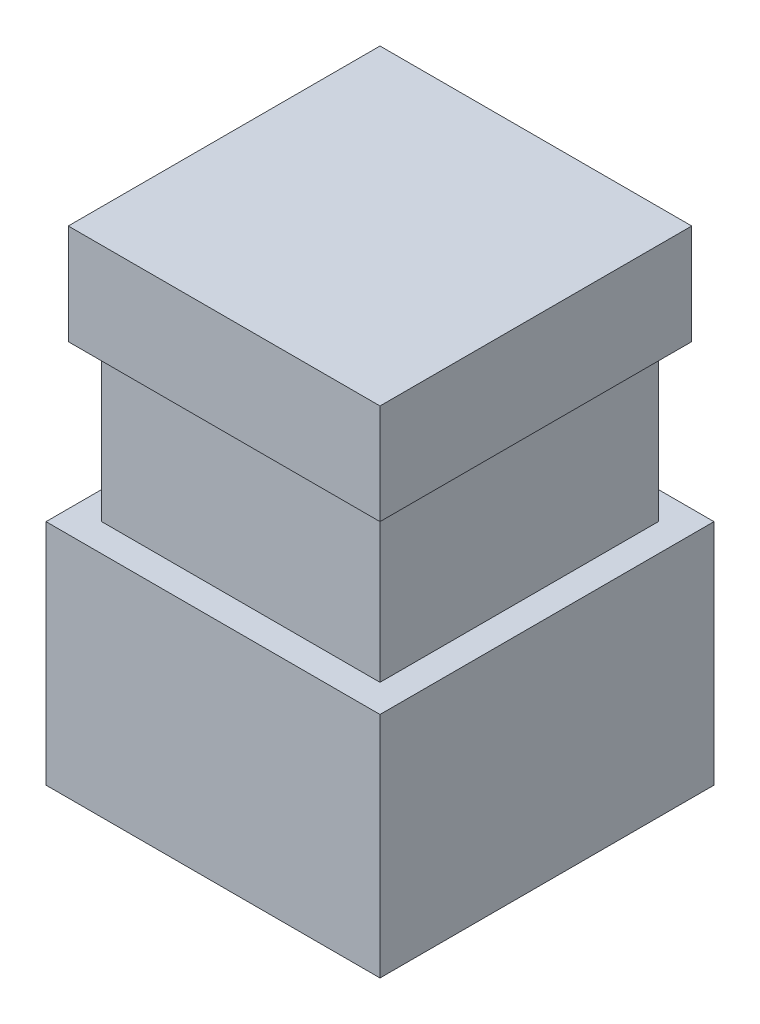
ISO-10303-21;
HEADER;
FILE_DESCRIPTION(('STEP AP214'),'2;1');
FILE_NAME('part.step','',(''),(''),'','','');
FILE_SCHEMA(('AUTOMOTIVE_DESIGN { 1 0 10303 214 1 1 1 1 }'));
ENDSEC;
DATA;
#1=APPLICATION_CONTEXT('core data for automotive mechanical design processes');
#2=APPLICATION_PROTOCOL_DEFINITION('international standard','automotive_design',2000,#1);
#3=PRODUCT_CONTEXT('',#1,'mechanical');
#4=PRODUCT('Part','Part','',(#3));
#5=PRODUCT_RELATED_PRODUCT_CATEGORY('part','',(#4));
#6=PRODUCT_DEFINITION_FORMATION('','',#4);
#7=PRODUCT_DEFINITION_CONTEXT('part definition',#1,'design');
#8=PRODUCT_DEFINITION('design','',#6,#7);
#9=PRODUCT_DEFINITION_SHAPE('','',#8);
#10=(LENGTH_UNIT() NAMED_UNIT(*) SI_UNIT(.MILLI.,.METRE.));
#11=(NAMED_UNIT(*) PLANE_ANGLE_UNIT() SI_UNIT($,.RADIAN.));
#12=(NAMED_UNIT(*) SI_UNIT($,.STERADIAN.) SOLID_ANGLE_UNIT());
#13=UNCERTAINTY_MEASURE_WITH_UNIT(LENGTH_MEASURE(1.E-05),#10,'distance_accuracy_value','');
#14=(GEOMETRIC_REPRESENTATION_CONTEXT(3) GLOBAL_UNCERTAINTY_ASSIGNED_CONTEXT((#13)) GLOBAL_UNIT_ASSIGNED_CONTEXT((#10,
#11,#12)) REPRESENTATION_CONTEXT('',''));
#15=CARTESIAN_POINT('',(0.,0.,0.));
#16=DIRECTION('',(0.,0.,1.));
#17=DIRECTION('',(1.,0.,0.));
#18=AXIS2_PLACEMENT_3D('',#15,#16,#17);
#19=CARTESIAN_POINT('',(0.,41.,0.));
#20=DIRECTION('',(0.,-1.,0.));
#21=DIRECTION('',(0.,0.,-1.));
#22=AXIS2_PLACEMENT_3D('',#19,#20,#21);
#23=PLANE('',#22);
#24=DIRECTION('',(0.,0.,1.));
#25=VECTOR('',#24,1.);
#26=CARTESIAN_POINT('',(0.,41.,0.));
#27=LINE('',#26,#25);
#28=CARTESIAN_POINT('',(0.,41.,-60.));
#29=VERTEX_POINT('',#28);
#30=CARTESIAN_POINT('',(0.,41.,0.));
#31=VERTEX_POINT('',#30);
#32=EDGE_CURVE('E220',#29,#31,#27,.T.);
#33=ORIENTED_EDGE('',*,*,#32,.T.);
#34=DIRECTION('',(1.,0.,0.));
#35=VECTOR('',#34,1.);
#36=CARTESIAN_POINT('',(0.,41.,0.));
#37=LINE('',#36,#35);
#38=CARTESIAN_POINT('',(60.,41.,0.));
#39=VERTEX_POINT('',#38);
#40=EDGE_CURVE('E223',#31,#39,#37,.T.);
#41=ORIENTED_EDGE('',*,*,#40,.T.);
#42=DIRECTION('',(0.,0.,-1.));
#43=VECTOR('',#42,1.);
#44=CARTESIAN_POINT('',(60.,41.,0.));
#45=LINE('',#44,#43);
#46=CARTESIAN_POINT('',(60.,41.,-60.));
#47=VERTEX_POINT('',#46);
#48=EDGE_CURVE('E226',#39,#47,#45,.T.);
#49=ORIENTED_EDGE('',*,*,#48,.T.);
#50=DIRECTION('',(-1.,0.,0.));
#51=VECTOR('',#50,1.);
#52=CARTESIAN_POINT('',(0.,41.,-60.));
#53=LINE('',#52,#51);
#54=EDGE_CURVE('E228',#47,#29,#53,.T.);
#55=ORIENTED_EDGE('',*,*,#54,.T.);
#56=EDGE_LOOP('',(#33,#41,#49,#55));
#57=FACE_BOUND('',#56,.T.);
#58=DIRECTION('',(0.,0.,1.));
#59=VECTOR('',#58,1.);
#60=CARTESIAN_POINT('',(5.,41.,-5.));
#61=LINE('',#60,#59);
#62=CARTESIAN_POINT('',(5.,41.,-55.));
#63=VERTEX_POINT('',#62);
#64=CARTESIAN_POINT('',(5.,41.,-5.));
#65=VERTEX_POINT('',#64);
#66=EDGE_CURVE('E159',#63,#65,#61,.T.);
#67=ORIENTED_EDGE('',*,*,#66,.F.);
#68=DIRECTION('',(-1.,0.,0.));
#69=VECTOR('',#68,1.);
#70=CARTESIAN_POINT('',(5.,41.,-55.));
#71=LINE('',#70,#69);
#72=CARTESIAN_POINT('',(55.,41.,-55.));
#73=VERTEX_POINT('',#72);
#74=EDGE_CURVE('E171',#73,#63,#71,.T.);
#75=ORIENTED_EDGE('',*,*,#74,.F.);
#76=DIRECTION('',(0.,0.,-1.));
#77=VECTOR('',#76,1.);
#78=CARTESIAN_POINT('',(55.,41.,-5.));
#79=LINE('',#78,#77);
#80=CARTESIAN_POINT('',(55.,41.,-5.));
#81=VERTEX_POINT('',#80);
#82=EDGE_CURVE('E55',#81,#73,#79,.T.);
#83=ORIENTED_EDGE('',*,*,#82,.F.);
#84=DIRECTION('',(1.,0.,0.));
#85=VECTOR('',#84,1.);
#86=CARTESIAN_POINT('',(5.,41.,-5.));
#87=LINE('',#86,#85);
#88=EDGE_CURVE('E50',#65,#81,#87,.T.);
#89=ORIENTED_EDGE('',*,*,#88,.F.);
#90=EDGE_LOOP('',(#67,#75,#83,#89));
#91=FACE_BOUND('',#90,.T.);
#92=ADVANCED_FACE('F35',(#57,#91),#23,.F.);
#93=CARTESIAN_POINT('',(0.,41.,0.));
#94=DIRECTION('',(1.,0.,0.));
#95=DIRECTION('',(0.,0.,-1.));
#96=AXIS2_PLACEMENT_3D('',#93,#94,#95);
#97=PLANE('',#96);
#98=DIRECTION('',(0.,0.,1.));
#99=VECTOR('',#98,1.);
#100=CARTESIAN_POINT('',(0.,0.,0.));
#101=LINE('',#100,#99);
#102=CARTESIAN_POINT('',(0.,0.,-60.));
#103=VERTEX_POINT('',#102);
#104=CARTESIAN_POINT('',(0.,0.,0.));
#105=VERTEX_POINT('',#104);
#106=EDGE_CURVE('E219',#103,#105,#101,.T.);
#107=ORIENTED_EDGE('',*,*,#106,.T.);
#108=DIRECTION('',(0.,-1.,0.));
#109=VECTOR('',#108,1.);
#110=CARTESIAN_POINT('',(0.,41.,0.));
#111=LINE('',#110,#109);
#112=EDGE_CURVE('E11',#31,#105,#111,.T.);
#113=ORIENTED_EDGE('',*,*,#112,.F.);
#114=ORIENTED_EDGE('',*,*,#32,.F.);
#115=DIRECTION('',(0.,-1.,0.));
#116=VECTOR('',#115,1.);
#117=CARTESIAN_POINT('',(0.,41.,-60.));
#118=LINE('',#117,#116);
#119=EDGE_CURVE('E230',#29,#103,#118,.T.);
#120=ORIENTED_EDGE('',*,*,#119,.T.);
#121=EDGE_LOOP('',(#107,#113,#114,#120));
#122=FACE_BOUND('',#121,.T.);
#123=ADVANCED_FACE('F37',(#122),#97,.F.);
#124=CARTESIAN_POINT('',(0.,41.,0.));
#125=DIRECTION('',(0.,0.,-1.));
#126=DIRECTION('',(-1.,0.,0.));
#127=AXIS2_PLACEMENT_3D('',#124,#125,#126);
#128=PLANE('',#127);
#129=DIRECTION('',(1.,0.,0.));
#130=VECTOR('',#129,1.);
#131=CARTESIAN_POINT('',(0.,0.,0.));
#132=LINE('',#131,#130);
#133=CARTESIAN_POINT('',(60.,0.,0.));
#134=VERTEX_POINT('',#133);
#135=EDGE_CURVE('E233',#105,#134,#132,.T.);
#136=ORIENTED_EDGE('',*,*,#135,.T.);
#137=DIRECTION('',(0.,-1.,0.));
#138=VECTOR('',#137,1.);
#139=CARTESIAN_POINT('',(60.,41.,0.));
#140=LINE('',#139,#138);
#141=EDGE_CURVE('E43',#39,#134,#140,.T.);
#142=ORIENTED_EDGE('',*,*,#141,.F.);
#143=ORIENTED_EDGE('',*,*,#40,.F.);
#144=ORIENTED_EDGE('',*,*,#112,.T.);
#145=EDGE_LOOP('',(#136,#142,#143,#144));
#146=FACE_BOUND('',#145,.T.);
#147=ADVANCED_FACE('F262',(#146),#128,.F.);
#148=CARTESIAN_POINT('',(60.,41.,0.));
#149=DIRECTION('',(-1.,0.,0.));
#150=DIRECTION('',(0.,0.,1.));
#151=AXIS2_PLACEMENT_3D('',#148,#149,#150);
#152=PLANE('',#151);
#153=DIRECTION('',(0.,0.,-1.));
#154=VECTOR('',#153,1.);
#155=CARTESIAN_POINT('',(60.,0.,0.));
#156=LINE('',#155,#154);
#157=CARTESIAN_POINT('',(60.,0.,-60.));
#158=VERTEX_POINT('',#157);
#159=EDGE_CURVE('E235',#134,#158,#156,.T.);
#160=ORIENTED_EDGE('',*,*,#159,.T.);
#161=DIRECTION('',(0.,-1.,0.));
#162=VECTOR('',#161,1.);
#163=CARTESIAN_POINT('',(60.,41.,-60.));
#164=LINE('',#163,#162);
#165=EDGE_CURVE('E240',#47,#158,#164,.T.);
#166=ORIENTED_EDGE('',*,*,#165,.F.);
#167=ORIENTED_EDGE('',*,*,#48,.F.);
#168=ORIENTED_EDGE('',*,*,#141,.T.);
#169=EDGE_LOOP('',(#160,#166,#167,#168));
#170=FACE_BOUND('',#169,.T.);
#171=ADVANCED_FACE('F247',(#170),#152,.F.);
#172=CARTESIAN_POINT('',(0.,41.,-60.));
#173=DIRECTION('',(0.,0.,1.));
#174=DIRECTION('',(1.,0.,0.));
#175=AXIS2_PLACEMENT_3D('',#172,#173,#174);
#176=PLANE('',#175);
#177=DIRECTION('',(-1.,0.,0.));
#178=VECTOR('',#177,1.);
#179=CARTESIAN_POINT('',(0.,0.,-60.));
#180=LINE('',#179,#178);
#181=EDGE_CURVE('E224',#158,#103,#180,.T.);
#182=ORIENTED_EDGE('',*,*,#181,.T.);
#183=ORIENTED_EDGE('',*,*,#119,.F.);
#184=ORIENTED_EDGE('',*,*,#54,.F.);
#185=ORIENTED_EDGE('',*,*,#165,.T.);
#186=EDGE_LOOP('',(#182,#183,#184,#185));
#187=FACE_BOUND('',#186,.T.);
#188=ADVANCED_FACE('F256',(#187),#176,.F.);
#189=CARTESIAN_POINT('',(0.,0.,0.));
#190=DIRECTION('',(0.,-1.,0.));
#191=DIRECTION('',(0.,0.,-1.));
#192=AXIS2_PLACEMENT_3D('',#189,#190,#191);
#193=PLANE('',#192);
#194=CARTESIAN_POINT('',(3.5,0.,-3.5));
#195=DIRECTION('',(0.,-1.,0.));
#196=DIRECTION('',(0.,0.,-1.));
#197=AXIS2_PLACEMENT_3D('',#194,#195,#196);
#198=CIRCLE('',#197,1.7);
#199=CARTESIAN_POINT('',(3.5,0.,-5.2));
#200=VERTEX_POINT('',#199);
#201=EDGE_CURVE('E195',#200,#200,#198,.T.);
#202=ORIENTED_EDGE('',*,*,#201,.F.);
#203=EDGE_LOOP('',(#202));
#204=FACE_BOUND('',#203,.T.);
#205=CARTESIAN_POINT('',(56.5,0.,-3.5));
#206=DIRECTION('',(0.,-1.,0.));
#207=DIRECTION('',(0.,0.,-1.));
#208=AXIS2_PLACEMENT_3D('',#205,#206,#207);
#209=CIRCLE('',#208,1.7);
#210=CARTESIAN_POINT('',(56.5,0.,-5.2));
#211=VERTEX_POINT('',#210);
#212=EDGE_CURVE('E201',#211,#211,#209,.T.);
#213=ORIENTED_EDGE('',*,*,#212,.F.);
#214=EDGE_LOOP('',(#213));
#215=FACE_BOUND('',#214,.T.);
#216=CARTESIAN_POINT('',(56.5,0.,-56.5));
#217=DIRECTION('',(0.,-1.,0.));
#218=DIRECTION('',(0.,0.,-1.));
#219=AXIS2_PLACEMENT_3D('',#216,#217,#218);
#220=CIRCLE('',#219,1.7);
#221=CARTESIAN_POINT('',(56.5,0.,-58.2));
#222=VERTEX_POINT('',#221);
#223=EDGE_CURVE('E207',#222,#222,#220,.T.);
#224=ORIENTED_EDGE('',*,*,#223,.F.);
#225=EDGE_LOOP('',(#224));
#226=FACE_BOUND('',#225,.T.);
#227=CARTESIAN_POINT('',(3.5,0.,-56.5));
#228=DIRECTION('',(0.,-1.,0.));
#229=DIRECTION('',(0.,0.,-1.));
#230=AXIS2_PLACEMENT_3D('',#227,#228,#229);
#231=CIRCLE('',#230,1.7);
#232=CARTESIAN_POINT('',(3.5,0.,-58.2));
#233=VERTEX_POINT('',#232);
#234=EDGE_CURVE('E213',#233,#233,#231,.T.);
#235=ORIENTED_EDGE('',*,*,#234,.F.);
#236=EDGE_LOOP('',(#235));
#237=FACE_BOUND('',#236,.T.);
#238=ORIENTED_EDGE('',*,*,#106,.F.);
#239=ORIENTED_EDGE('',*,*,#181,.F.);
#240=ORIENTED_EDGE('',*,*,#159,.F.);
#241=ORIENTED_EDGE('',*,*,#135,.F.);
#242=EDGE_LOOP('',(#238,#239,#240,#241));
#243=FACE_BOUND('',#242,.T.);
#244=ADVANCED_FACE('F253',(#204,#215,#226,#237,#243),#193,.T.);
#245=CARTESIAN_POINT('',(3.5,7.,-56.5));
#246=DIRECTION('',(0.,-1.,0.));
#247=DIRECTION('',(0.,0.,-1.));
#248=AXIS2_PLACEMENT_3D('',#245,#246,#247);
#249=CONICAL_SURFACE('',#248,1.7,1.02974425867665);
#250=CARTESIAN_POINT('',(3.49999999999999,8.02146305234685,-56.5));
#251=VERTEX_POINT('',#250);
#252=VERTEX_LOOP('',#251);
#253=FACE_BOUND('',#252,.T.);
#254=CARTESIAN_POINT('',(3.5,7.,-56.5));
#255=DIRECTION('',(0.,-1.,0.));
#256=DIRECTION('',(0.,0.,-1.));
#257=AXIS2_PLACEMENT_3D('',#254,#255,#256);
#258=CIRCLE('',#257,1.7);
#259=CARTESIAN_POINT('',(3.5,7.,-58.2));
#260=VERTEX_POINT('',#259);
#261=EDGE_CURVE('E216',#260,#260,#258,.T.);
#262=ORIENTED_EDGE('',*,*,#261,.T.);
#263=EDGE_LOOP('',(#262));
#264=FACE_BOUND('',#263,.T.);
#265=ADVANCED_FACE('F275',(#253,#264),#249,.F.);
#266=CARTESIAN_POINT('',(3.5,0.,-56.5));
#267=DIRECTION('',(0.,-1.,0.));
#268=DIRECTION('',(0.,0.,-1.));
#269=AXIS2_PLACEMENT_3D('',#266,#267,#268);
#270=CYLINDRICAL_SURFACE('',#269,1.7);
#271=ORIENTED_EDGE('',*,*,#261,.F.);
#272=EDGE_LOOP('',(#271));
#273=FACE_BOUND('',#272,.T.);
#274=ORIENTED_EDGE('',*,*,#234,.T.);
#275=EDGE_LOOP('',(#274));
#276=FACE_BOUND('',#275,.T.);
#277=ADVANCED_FACE('F295',(#273,#276),#270,.F.);
#278=CARTESIAN_POINT('',(56.5,7.,-56.5));
#279=DIRECTION('',(0.,-1.,0.));
#280=DIRECTION('',(0.,0.,-1.));
#281=AXIS2_PLACEMENT_3D('',#278,#279,#280);
#282=CONICAL_SURFACE('',#281,1.7,1.02974425867665);
#283=CARTESIAN_POINT('',(56.5,8.02146305234685,-56.5));
#284=VERTEX_POINT('',#283);
#285=VERTEX_LOOP('',#284);
#286=FACE_BOUND('',#285,.T.);
#287=CARTESIAN_POINT('',(56.5,7.,-56.5));
#288=DIRECTION('',(0.,-1.,0.));
#289=DIRECTION('',(0.,0.,-1.));
#290=AXIS2_PLACEMENT_3D('',#287,#288,#289);
#291=CIRCLE('',#290,1.7);
#292=CARTESIAN_POINT('',(56.5,7.,-58.2));
#293=VERTEX_POINT('',#292);
#294=EDGE_CURVE('E210',#293,#293,#291,.T.);
#295=ORIENTED_EDGE('',*,*,#294,.T.);
#296=EDGE_LOOP('',(#295));
#297=FACE_BOUND('',#296,.T.);
#298=ADVANCED_FACE('F302',(#286,#297),#282,.F.);
#299=CARTESIAN_POINT('',(56.5,0.,-56.5));
#300=DIRECTION('',(0.,-1.,0.));
#301=DIRECTION('',(0.,0.,-1.));
#302=AXIS2_PLACEMENT_3D('',#299,#300,#301);
#303=CYLINDRICAL_SURFACE('',#302,1.7);
#304=ORIENTED_EDGE('',*,*,#294,.F.);
#305=EDGE_LOOP('',(#304));
#306=FACE_BOUND('',#305,.T.);
#307=ORIENTED_EDGE('',*,*,#223,.T.);
#308=EDGE_LOOP('',(#307));
#309=FACE_BOUND('',#308,.T.);
#310=ADVANCED_FACE('F309',(#306,#309),#303,.F.);
#311=CARTESIAN_POINT('',(56.5,7.,-3.5));
#312=DIRECTION('',(0.,-1.,0.));
#313=DIRECTION('',(0.,0.,-1.));
#314=AXIS2_PLACEMENT_3D('',#311,#312,#313);
#315=CONICAL_SURFACE('',#314,1.7,1.02974425867665);
#316=CARTESIAN_POINT('',(56.5,8.02146305234685,-3.5));
#317=VERTEX_POINT('',#316);
#318=VERTEX_LOOP('',#317);
#319=FACE_BOUND('',#318,.T.);
#320=CARTESIAN_POINT('',(56.5,7.,-3.5));
#321=DIRECTION('',(0.,-1.,0.));
#322=DIRECTION('',(0.,0.,-1.));
#323=AXIS2_PLACEMENT_3D('',#320,#321,#322);
#324=CIRCLE('',#323,1.7);
#325=CARTESIAN_POINT('',(56.5,7.,-5.2));
#326=VERTEX_POINT('',#325);
#327=EDGE_CURVE('E204',#326,#326,#324,.T.);
#328=ORIENTED_EDGE('',*,*,#327,.T.);
#329=EDGE_LOOP('',(#328));
#330=FACE_BOUND('',#329,.T.);
#331=ADVANCED_FACE('F317',(#319,#330),#315,.F.);
#332=CARTESIAN_POINT('',(56.5,0.,-3.5));
#333=DIRECTION('',(0.,-1.,0.));
#334=DIRECTION('',(0.,0.,-1.));
#335=AXIS2_PLACEMENT_3D('',#332,#333,#334);
#336=CYLINDRICAL_SURFACE('',#335,1.7);
#337=ORIENTED_EDGE('',*,*,#327,.F.);
#338=EDGE_LOOP('',(#337));
#339=FACE_BOUND('',#338,.T.);
#340=ORIENTED_EDGE('',*,*,#212,.T.);
#341=EDGE_LOOP('',(#340));
#342=FACE_BOUND('',#341,.T.);
#343=ADVANCED_FACE('F325',(#339,#342),#336,.F.);
#344=CARTESIAN_POINT('',(3.5,7.,-3.5));
#345=DIRECTION('',(0.,-1.,0.));
#346=DIRECTION('',(0.,0.,-1.));
#347=AXIS2_PLACEMENT_3D('',#344,#345,#346);
#348=CONICAL_SURFACE('',#347,1.7,1.02974425867665);
#349=CARTESIAN_POINT('',(3.5,8.02146305234685,-3.5));
#350=VERTEX_POINT('',#349);
#351=VERTEX_LOOP('',#350);
#352=FACE_BOUND('',#351,.T.);
#353=CARTESIAN_POINT('',(3.5,7.,-3.5));
#354=DIRECTION('',(0.,-1.,0.));
#355=DIRECTION('',(0.,0.,-1.));
#356=AXIS2_PLACEMENT_3D('',#353,#354,#355);
#357=CIRCLE('',#356,1.7);
#358=CARTESIAN_POINT('',(3.5,7.,-5.2));
#359=VERTEX_POINT('',#358);
#360=EDGE_CURVE('E198',#359,#359,#357,.T.);
#361=ORIENTED_EDGE('',*,*,#360,.T.);
#362=EDGE_LOOP('',(#361));
#363=FACE_BOUND('',#362,.T.);
#364=ADVANCED_FACE('F333',(#352,#363),#348,.F.);
#365=CARTESIAN_POINT('',(3.5,0.,-3.5));
#366=DIRECTION('',(0.,-1.,0.));
#367=DIRECTION('',(0.,0.,-1.));
#368=AXIS2_PLACEMENT_3D('',#365,#366,#367);
#369=CYLINDRICAL_SURFACE('',#368,1.7);
#370=ORIENTED_EDGE('',*,*,#360,.F.);
#371=EDGE_LOOP('',(#370));
#372=FACE_BOUND('',#371,.T.);
#373=ORIENTED_EDGE('',*,*,#201,.T.);
#374=EDGE_LOOP('',(#373));
#375=FACE_BOUND('',#374,.T.);
#376=ADVANCED_FACE('F341',(#372,#375),#369,.F.);
#377=CARTESIAN_POINT('',(5.,69.,-5.));
#378=DIRECTION('',(1.,0.,0.));
#379=DIRECTION('',(0.,0.,-1.));
#380=AXIS2_PLACEMENT_3D('',#377,#378,#379);
#381=PLANE('',#380);
#382=ORIENTED_EDGE('',*,*,#66,.T.);
#383=DIRECTION('',(0.,-1.,0.));
#384=VECTOR('',#383,1.);
#385=CARTESIAN_POINT('',(5.,69.,-5.));
#386=LINE('',#385,#384);
#387=CARTESIAN_POINT('',(5.,69.,-5.));
#388=VERTEX_POINT('',#387);
#389=EDGE_CURVE('E193',#388,#65,#386,.T.);
#390=ORIENTED_EDGE('',*,*,#389,.F.);
#391=DIRECTION('',(0.,0.,1.));
#392=VECTOR('',#391,1.);
#393=CARTESIAN_POINT('',(5.,69.,-5.));
#394=LINE('',#393,#392);
#395=CARTESIAN_POINT('',(5.,69.,-55.));
#396=VERTEX_POINT('',#395);
#397=EDGE_CURVE('E167',#396,#388,#394,.T.);
#398=ORIENTED_EDGE('',*,*,#397,.F.);
#399=DIRECTION('',(0.,-1.,0.));
#400=VECTOR('',#399,1.);
#401=CARTESIAN_POINT('',(5.,69.,-55.));
#402=LINE('',#401,#400);
#403=EDGE_CURVE('E179',#396,#63,#402,.T.);
#404=ORIENTED_EDGE('',*,*,#403,.T.);
#405=EDGE_LOOP('',(#382,#390,#398,#404));
#406=FACE_BOUND('',#405,.T.);
#407=ADVANCED_FACE('F349',(#406),#381,.F.);
#408=CARTESIAN_POINT('',(5.,69.,-5.));
#409=DIRECTION('',(0.,0.,-1.));
#410=DIRECTION('',(-1.,0.,0.));
#411=AXIS2_PLACEMENT_3D('',#408,#409,#410);
#412=PLANE('',#411);
#413=ORIENTED_EDGE('',*,*,#88,.T.);
#414=DIRECTION('',(0.,-1.,0.));
#415=VECTOR('',#414,1.);
#416=CARTESIAN_POINT('',(55.,69.,-5.));
#417=LINE('',#416,#415);
#418=CARTESIAN_POINT('',(55.,69.,-5.));
#419=VERTEX_POINT('',#418);
#420=EDGE_CURVE('E190',#419,#81,#417,.T.);
#421=ORIENTED_EDGE('',*,*,#420,.F.);
#422=DIRECTION('',(1.,0.,0.));
#423=VECTOR('',#422,1.);
#424=CARTESIAN_POINT('',(5.,69.,-5.));
#425=LINE('',#424,#423);
#426=EDGE_CURVE('E170',#388,#419,#425,.T.);
#427=ORIENTED_EDGE('',*,*,#426,.F.);
#428=ORIENTED_EDGE('',*,*,#389,.T.);
#429=EDGE_LOOP('',(#413,#421,#427,#428));
#430=FACE_BOUND('',#429,.T.);
#431=ADVANCED_FACE('F357',(#430),#412,.F.);
#432=CARTESIAN_POINT('',(55.,69.,-5.));
#433=DIRECTION('',(-1.,0.,0.));
#434=DIRECTION('',(0.,0.,1.));
#435=AXIS2_PLACEMENT_3D('',#432,#433,#434);
#436=PLANE('',#435);
#437=ORIENTED_EDGE('',*,*,#82,.T.);
#438=DIRECTION('',(0.,-1.,0.));
#439=VECTOR('',#438,1.);
#440=CARTESIAN_POINT('',(55.,69.,-55.));
#441=LINE('',#440,#439);
#442=CARTESIAN_POINT('',(55.,69.,-55.));
#443=VERTEX_POINT('',#442);
#444=EDGE_CURVE('E187',#443,#73,#441,.T.);
#445=ORIENTED_EDGE('',*,*,#444,.F.);
#446=DIRECTION('',(0.,0.,-1.));
#447=VECTOR('',#446,1.);
#448=CARTESIAN_POINT('',(55.,69.,-5.));
#449=LINE('',#448,#447);
#450=EDGE_CURVE('E174',#419,#443,#449,.T.);
#451=ORIENTED_EDGE('',*,*,#450,.F.);
#452=ORIENTED_EDGE('',*,*,#420,.T.);
#453=EDGE_LOOP('',(#437,#445,#451,#452));
#454=FACE_BOUND('',#453,.T.);
#455=ADVANCED_FACE('F365',(#454),#436,.F.);
#456=CARTESIAN_POINT('',(5.,69.,-55.));
#457=DIRECTION('',(0.,0.,1.));
#458=DIRECTION('',(1.,0.,0.));
#459=AXIS2_PLACEMENT_3D('',#456,#457,#458);
#460=PLANE('',#459);
#461=ORIENTED_EDGE('',*,*,#74,.T.);
#462=ORIENTED_EDGE('',*,*,#403,.F.);
#463=DIRECTION('',(-1.,0.,0.));
#464=VECTOR('',#463,1.);
#465=CARTESIAN_POINT('',(5.,69.,-55.));
#466=LINE('',#465,#464);
#467=EDGE_CURVE('E177',#443,#396,#466,.T.);
#468=ORIENTED_EDGE('',*,*,#467,.F.);
#469=ORIENTED_EDGE('',*,*,#444,.T.);
#470=EDGE_LOOP('',(#461,#462,#468,#469));
#471=FACE_BOUND('',#470,.T.);
#472=ADVANCED_FACE('F373',(#471),#460,.F.);
#473=CARTESIAN_POINT('',(0.,69.,0.));
#474=DIRECTION('',(0.,1.,0.));
#475=DIRECTION('',(0.,0.,1.));
#476=AXIS2_PLACEMENT_3D('',#473,#474,#475);
#477=PLANE('',#476);
#478=DIRECTION('',(0.,0.,-1.));
#479=VECTOR('',#478,1.);
#480=CARTESIAN_POINT('',(58.,69.,-2.));
#481=LINE('',#480,#479);
#482=CARTESIAN_POINT('',(58.,69.,-2.));
#483=VERTEX_POINT('',#482);
#484=CARTESIAN_POINT('',(58.,69.,-58.));
#485=VERTEX_POINT('',#484);
#486=EDGE_CURVE('E158',#483,#485,#481,.T.);
#487=ORIENTED_EDGE('',*,*,#486,.F.);
#488=DIRECTION('',(1.,0.,0.));
#489=VECTOR('',#488,1.);
#490=CARTESIAN_POINT('',(58.,69.,-2.));
#491=LINE('',#490,#489);
#492=CARTESIAN_POINT('',(2.,69.,-1.99999999999999));
#493=VERTEX_POINT('',#492);
#494=EDGE_CURVE('E154',#493,#483,#491,.T.);
#495=ORIENTED_EDGE('',*,*,#494,.F.);
#496=DIRECTION('',(0.,0.,1.));
#497=VECTOR('',#496,1.);
#498=CARTESIAN_POINT('',(2.,69.,-1.99999999999999));
#499=LINE('',#498,#497);
#500=CARTESIAN_POINT('',(2.,69.,-58.));
#501=VERTEX_POINT('',#500);
#502=EDGE_CURVE('E489',#501,#493,#499,.T.);
#503=ORIENTED_EDGE('',*,*,#502,.F.);
#504=DIRECTION('',(-1.,0.,0.));
#505=VECTOR('',#504,1.);
#506=CARTESIAN_POINT('',(58.,69.,-58.));
#507=LINE('',#506,#505);
#508=EDGE_CURVE('E493',#485,#501,#507,.T.);
#509=ORIENTED_EDGE('',*,*,#508,.F.);
#510=EDGE_LOOP('',(#487,#495,#503,#509));
#511=FACE_BOUND('',#510,.T.);
#512=ORIENTED_EDGE('',*,*,#467,.T.);
#513=ORIENTED_EDGE('',*,*,#397,.T.);
#514=ORIENTED_EDGE('',*,*,#426,.T.);
#515=ORIENTED_EDGE('',*,*,#450,.T.);
#516=EDGE_LOOP('',(#512,#513,#514,#515));
#517=FACE_BOUND('',#516,.T.);
#518=ADVANCED_FACE('F381',(#511,#517),#477,.F.);
#519=CARTESIAN_POINT('',(58.,87.,-2.));
#520=DIRECTION('',(-1.,0.,0.));
#521=DIRECTION('',(0.,0.,1.));
#522=AXIS2_PLACEMENT_3D('',#519,#520,#521);
#523=PLANE('',#522);
#524=ORIENTED_EDGE('',*,*,#486,.T.);
#525=DIRECTION('',(0.,-1.,0.));
#526=VECTOR('',#525,1.);
#527=CARTESIAN_POINT('',(58.,87.,-58.));
#528=LINE('',#527,#526);
#529=CARTESIAN_POINT('',(58.,87.,-58.));
#530=VERTEX_POINT('',#529);
#531=EDGE_CURVE('E138',#530,#485,#528,.T.);
#532=ORIENTED_EDGE('',*,*,#531,.F.);
#533=DIRECTION('',(0.,0.,-1.));
#534=VECTOR('',#533,1.);
#535=CARTESIAN_POINT('',(58.,87.,-2.));
#536=LINE('',#535,#534);
#537=CARTESIAN_POINT('',(58.,87.,-2.));
#538=VERTEX_POINT('',#537);
#539=EDGE_CURVE('E145',#538,#530,#536,.T.);
#540=ORIENTED_EDGE('',*,*,#539,.F.);
#541=DIRECTION('',(0.,-1.,0.));
#542=VECTOR('',#541,1.);
#543=CARTESIAN_POINT('',(58.,87.,-2.));
#544=LINE('',#543,#542);
#545=EDGE_CURVE('E486',#538,#483,#544,.T.);
#546=ORIENTED_EDGE('',*,*,#545,.T.);
#547=EDGE_LOOP('',(#524,#532,#540,#546));
#548=FACE_BOUND('',#547,.T.);
#549=ADVANCED_FACE('F156',(#548),#523,.F.);
#550=CARTESIAN_POINT('',(58.,87.,-58.));
#551=DIRECTION('',(0.,0.,1.));
#552=DIRECTION('',(1.,0.,0.));
#553=AXIS2_PLACEMENT_3D('',#550,#551,#552);
#554=PLANE('',#553);
#555=ORIENTED_EDGE('',*,*,#508,.T.);
#556=DIRECTION('',(0.,-1.,0.));
#557=VECTOR('',#556,1.);
#558=CARTESIAN_POINT('',(2.,87.,-58.));
#559=LINE('',#558,#557);
#560=CARTESIAN_POINT('',(2.,87.,-58.));
#561=VERTEX_POINT('',#560);
#562=EDGE_CURVE('E141',#561,#501,#559,.T.);
#563=ORIENTED_EDGE('',*,*,#562,.F.);
#564=DIRECTION('',(-1.,0.,0.));
#565=VECTOR('',#564,1.);
#566=CARTESIAN_POINT('',(58.,87.,-58.));
#567=LINE('',#566,#565);
#568=EDGE_CURVE('E134',#530,#561,#567,.T.);
#569=ORIENTED_EDGE('',*,*,#568,.F.);
#570=ORIENTED_EDGE('',*,*,#531,.T.);
#571=EDGE_LOOP('',(#555,#563,#569,#570));
#572=FACE_BOUND('',#571,.T.);
#573=ADVANCED_FACE('F136',(#572),#554,.F.);
#574=CARTESIAN_POINT('',(2.,87.,-1.99999999999999));
#575=DIRECTION('',(1.,0.,0.));
#576=DIRECTION('',(0.,0.,-1.));
#577=AXIS2_PLACEMENT_3D('',#574,#575,#576);
#578=PLANE('',#577);
#579=ORIENTED_EDGE('',*,*,#502,.T.);
#580=DIRECTION('',(0.,-1.,0.));
#581=VECTOR('',#580,1.);
#582=CARTESIAN_POINT('',(2.,87.,-1.99999999999999));
#583=LINE('',#582,#581);
#584=CARTESIAN_POINT('',(2.,87.,-1.99999999999999));
#585=VERTEX_POINT('',#584);
#586=EDGE_CURVE('E163',#585,#493,#583,.T.);
#587=ORIENTED_EDGE('',*,*,#586,.F.);
#588=DIRECTION('',(0.,0.,1.));
#589=VECTOR('',#588,1.);
#590=CARTESIAN_POINT('',(2.,87.,-1.99999999999999));
#591=LINE('',#590,#589);
#592=EDGE_CURVE('E144',#561,#585,#591,.T.);
#593=ORIENTED_EDGE('',*,*,#592,.F.);
#594=ORIENTED_EDGE('',*,*,#562,.T.);
#595=EDGE_LOOP('',(#579,#587,#593,#594));
#596=FACE_BOUND('',#595,.T.);
#597=ADVANCED_FACE('F402',(#596),#578,.F.);
#598=CARTESIAN_POINT('',(58.,87.,-2.));
#599=DIRECTION('',(0.,0.,-1.));
#600=DIRECTION('',(-1.,0.,0.));
#601=AXIS2_PLACEMENT_3D('',#598,#599,#600);
#602=PLANE('',#601);
#603=ORIENTED_EDGE('',*,*,#494,.T.);
#604=ORIENTED_EDGE('',*,*,#545,.F.);
#605=DIRECTION('',(1.,0.,0.));
#606=VECTOR('',#605,1.);
#607=CARTESIAN_POINT('',(58.,87.,-2.));
#608=LINE('',#607,#606);
#609=EDGE_CURVE('E150',#585,#538,#608,.T.);
#610=ORIENTED_EDGE('',*,*,#609,.F.);
#611=ORIENTED_EDGE('',*,*,#586,.T.);
#612=EDGE_LOOP('',(#603,#604,#610,#611));
#613=FACE_BOUND('',#612,.T.);
#614=ADVANCED_FACE('F409',(#613),#602,.F.);
#615=CARTESIAN_POINT('',(0.,87.,0.));
#616=DIRECTION('',(0.,1.,0.));
#617=DIRECTION('',(0.,0.,1.));
#618=AXIS2_PLACEMENT_3D('',#615,#616,#617);
#619=PLANE('',#618);
#620=ORIENTED_EDGE('',*,*,#539,.T.);
#621=ORIENTED_EDGE('',*,*,#568,.T.);
#622=ORIENTED_EDGE('',*,*,#592,.T.);
#623=ORIENTED_EDGE('',*,*,#609,.T.);
#624=EDGE_LOOP('',(#620,#621,#622,#623));
#625=FACE_BOUND('',#624,.T.);
#626=ADVANCED_FACE('F148',(#625),#619,.T.);
#627=CLOSED_SHELL('',(#92,#123,#147,#171,#188,#244,#265,#277,#298,#310,#331,#343,#364,#376,#407,
#431,#455,#472,#518,#549,#573,#597,#614,#626));
#628=MANIFOLD_SOLID_BREP('B2',#627);
#629=ADVANCED_BREP_SHAPE_REPRESENTATION('',(#18,#628),#14);
#630=SHAPE_DEFINITION_REPRESENTATION(#9,#629);
ENDSEC;
END-ISO-10303-21;
